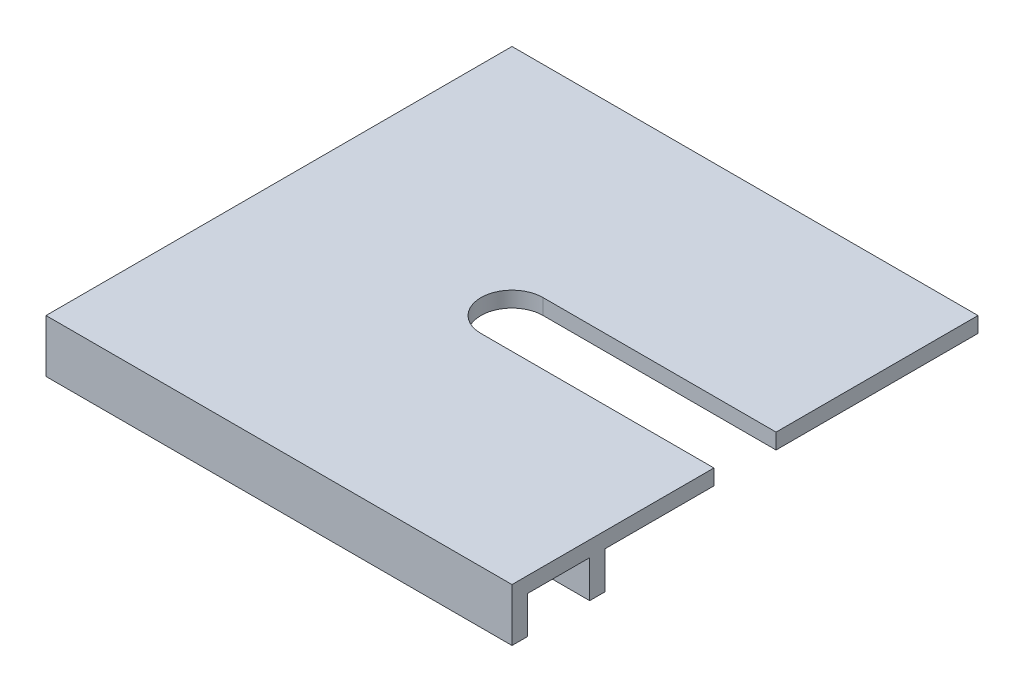
ISO-10303-21;
HEADER;
FILE_DESCRIPTION(('STEP AP214'),'2;1');
FILE_NAME('part.step','',(''),(''),'','','');
FILE_SCHEMA(('AUTOMOTIVE_DESIGN { 1 0 10303 214 1 1 1 1 }'));
ENDSEC;
DATA;
#1=APPLICATION_CONTEXT('core data for automotive mechanical design processes');
#2=APPLICATION_PROTOCOL_DEFINITION('international standard','automotive_design',2000,#1);
#3=PRODUCT_CONTEXT('',#1,'mechanical');
#4=PRODUCT('Part','Part','',(#3));
#5=PRODUCT_RELATED_PRODUCT_CATEGORY('part','',(#4));
#6=PRODUCT_DEFINITION_FORMATION('','',#4);
#7=PRODUCT_DEFINITION_CONTEXT('part definition',#1,'design');
#8=PRODUCT_DEFINITION('design','',#6,#7);
#9=PRODUCT_DEFINITION_SHAPE('','',#8);
#10=(LENGTH_UNIT() NAMED_UNIT(*) SI_UNIT(.MILLI.,.METRE.));
#11=(NAMED_UNIT(*) PLANE_ANGLE_UNIT() SI_UNIT($,.RADIAN.));
#12=(NAMED_UNIT(*) SI_UNIT($,.STERADIAN.) SOLID_ANGLE_UNIT());
#13=UNCERTAINTY_MEASURE_WITH_UNIT(LENGTH_MEASURE(1.E-05),#10,'distance_accuracy_value','');
#14=(GEOMETRIC_REPRESENTATION_CONTEXT(3) GLOBAL_UNCERTAINTY_ASSIGNED_CONTEXT((#13)) GLOBAL_UNIT_ASSIGNED_CONTEXT((#10,
#11,#12)) REPRESENTATION_CONTEXT('',''));
#15=CARTESIAN_POINT('',(0.,0.,0.));
#16=DIRECTION('',(0.,0.,1.));
#17=DIRECTION('',(1.,0.,0.));
#18=AXIS2_PLACEMENT_3D('',#15,#16,#17);
#19=CARTESIAN_POINT('',(0.,0.,0.));
#20=DIRECTION('',(0.,1.,0.));
#21=DIRECTION('',(0.,0.,1.));
#22=AXIS2_PLACEMENT_3D('',#19,#20,#21);
#23=PLANE('',#22);
#24=DIRECTION('',(1.,0.,0.));
#25=VECTOR('',#24,1.);
#26=CARTESIAN_POINT('',(0.,0.,-12.));
#27=LINE('',#26,#25);
#28=CARTESIAN_POINT('',(12.,0.,-12.));
#29=VERTEX_POINT('',#28);
#30=CARTESIAN_POINT('',(60.,0.,-12.));
#31=VERTEX_POINT('',#30);
#32=EDGE_CURVE('E271',#29,#31,#27,.T.);
#33=ORIENTED_EDGE('',*,*,#32,.F.);
#34=DIRECTION('',(0.,0.,1.));
#35=VECTOR('',#34,1.);
#36=CARTESIAN_POINT('',(12.,0.,0.));
#37=LINE('',#36,#35);
#38=CARTESIAN_POINT('',(12.,0.,-60.));
#39=VERTEX_POINT('',#38);
#40=EDGE_CURVE('E268',#39,#29,#37,.T.);
#41=ORIENTED_EDGE('',*,*,#40,.F.);
#42=DIRECTION('',(1.,0.,0.));
#43=VECTOR('',#42,1.);
#44=CARTESIAN_POINT('',(0.,0.,-60.));
#45=LINE('',#44,#43);
#46=CARTESIAN_POINT('',(60.,0.,-60.));
#47=VERTEX_POINT('',#46);
#48=EDGE_CURVE('E317',#39,#47,#45,.T.);
#49=ORIENTED_EDGE('',*,*,#48,.T.);
#50=DIRECTION('',(0.,0.,-1.));
#51=VECTOR('',#50,1.);
#52=CARTESIAN_POINT('',(60.,0.,0.));
#53=LINE('',#52,#51);
#54=CARTESIAN_POINT('',(60.,0.,-34.));
#55=VERTEX_POINT('',#54);
#56=EDGE_CURVE('E314',#55,#47,#53,.T.);
#57=ORIENTED_EDGE('',*,*,#56,.F.);
#58=DIRECTION('',(-1.,0.,0.));
#59=VECTOR('',#58,1.);
#60=CARTESIAN_POINT('',(0.,0.,-34.));
#61=LINE('',#60,#59);
#62=CARTESIAN_POINT('',(30.,0.,-34.));
#63=VERTEX_POINT('',#62);
#64=EDGE_CURVE('E311',#55,#63,#61,.T.);
#65=ORIENTED_EDGE('',*,*,#64,.T.);
#66=CARTESIAN_POINT('',(30.,0.,-30.));
#67=DIRECTION('',(0.,1.,0.));
#68=DIRECTION('',(0.,0.,1.));
#69=AXIS2_PLACEMENT_3D('',#66,#67,#68);
#70=CIRCLE('',#69,4.);
#71=CARTESIAN_POINT('',(30.,0.,-26.));
#72=VERTEX_POINT('',#71);
#73=EDGE_CURVE('E286',#63,#72,#70,.T.);
#74=ORIENTED_EDGE('',*,*,#73,.T.);
#75=DIRECTION('',(1.,0.,0.));
#76=VECTOR('',#75,1.);
#77=CARTESIAN_POINT('',(0.,0.,-26.));
#78=LINE('',#77,#76);
#79=CARTESIAN_POINT('',(60.,0.,-26.));
#80=VERTEX_POINT('',#79);
#81=EDGE_CURVE('E291',#72,#80,#78,.T.);
#82=ORIENTED_EDGE('',*,*,#81,.T.);
#83=EDGE_CURVE('E318',#31,#80,#53,.T.);
#84=ORIENTED_EDGE('',*,*,#83,.F.);
#85=EDGE_LOOP('',(#33,#41,#49,#57,#65,#74,#82,#84));
#86=FACE_BOUND('',#85,.T.);
#87=ADVANCED_FACE('F73',(#86),#23,.F.);
#88=DIRECTION('',(-1.,0.,0.));
#89=VECTOR('',#88,1.);
#90=CARTESIAN_POINT('',(0.,0.,-2.));
#91=LINE('',#90,#89);
#92=CARTESIAN_POINT('',(60.,0.,-2.));
#93=VERTEX_POINT('',#92);
#94=CARTESIAN_POINT('',(2.,0.,-2.));
#95=VERTEX_POINT('',#94);
#96=EDGE_CURVE('E236',#93,#95,#91,.T.);
#97=ORIENTED_EDGE('',*,*,#96,.T.);
#98=DIRECTION('',(0.,0.,-1.));
#99=VECTOR('',#98,1.);
#100=CARTESIAN_POINT('',(2.,0.,0.));
#101=LINE('',#100,#99);
#102=CARTESIAN_POINT('',(2.,0.,-60.));
#103=VERTEX_POINT('',#102);
#104=EDGE_CURVE('E246',#95,#103,#101,.T.);
#105=ORIENTED_EDGE('',*,*,#104,.T.);
#106=CARTESIAN_POINT('',(9.99999999999999,0.,-60.));
#107=VERTEX_POINT('',#106);
#108=EDGE_CURVE('E319',#103,#107,#45,.T.);
#109=ORIENTED_EDGE('',*,*,#108,.T.);
#110=DIRECTION('',(0.,0.,-1.));
#111=VECTOR('',#110,1.);
#112=CARTESIAN_POINT('',(10.,0.,0.));
#113=LINE('',#112,#111);
#114=CARTESIAN_POINT('',(10.,0.,-10.));
#115=VERTEX_POINT('',#114);
#116=EDGE_CURVE('E265',#115,#107,#113,.T.);
#117=ORIENTED_EDGE('',*,*,#116,.F.);
#118=DIRECTION('',(-1.,0.,0.));
#119=VECTOR('',#118,1.);
#120=CARTESIAN_POINT('',(0.,0.,-10.));
#121=LINE('',#120,#119);
#122=CARTESIAN_POINT('',(60.,0.,-10.));
#123=VERTEX_POINT('',#122);
#124=EDGE_CURVE('E242',#123,#115,#121,.T.);
#125=ORIENTED_EDGE('',*,*,#124,.F.);
#126=EDGE_CURVE('E258',#93,#123,#53,.T.);
#127=ORIENTED_EDGE('',*,*,#126,.F.);
#128=EDGE_LOOP('',(#97,#105,#109,#117,#125,#127));
#129=FACE_BOUND('',#128,.T.);
#130=ADVANCED_FACE('F255',(#129),#23,.F.);
#131=CARTESIAN_POINT('',(30.,2.,-30.));
#132=DIRECTION('',(0.,-1.,0.));
#133=DIRECTION('',(0.,0.,-1.));
#134=AXIS2_PLACEMENT_3D('',#131,#132,#133);
#135=CYLINDRICAL_SURFACE('',#134,4.);
#136=ORIENTED_EDGE('',*,*,#73,.F.);
#137=DIRECTION('',(0.,-1.,0.));
#138=VECTOR('',#137,1.);
#139=CARTESIAN_POINT('',(30.,2.,-34.));
#140=LINE('',#139,#138);
#141=CARTESIAN_POINT('',(30.,2.,-34.));
#142=VERTEX_POINT('',#141);
#143=EDGE_CURVE('E341',#142,#63,#140,.T.);
#144=ORIENTED_EDGE('',*,*,#143,.F.);
#145=CARTESIAN_POINT('',(30.,2.,-30.));
#146=DIRECTION('',(0.,1.,0.));
#147=DIRECTION('',(0.,0.,1.));
#148=AXIS2_PLACEMENT_3D('',#145,#146,#147);
#149=CIRCLE('',#148,4.);
#150=CARTESIAN_POINT('',(30.,2.,-26.));
#151=VERTEX_POINT('',#150);
#152=EDGE_CURVE('E287',#142,#151,#149,.T.);
#153=ORIENTED_EDGE('',*,*,#152,.T.);
#154=DIRECTION('',(0.,-1.,0.));
#155=VECTOR('',#154,1.);
#156=CARTESIAN_POINT('',(30.,2.,-26.));
#157=LINE('',#156,#155);
#158=EDGE_CURVE('E308',#151,#72,#157,.T.);
#159=ORIENTED_EDGE('',*,*,#158,.T.);
#160=EDGE_LOOP('',(#136,#144,#153,#159));
#161=FACE_BOUND('',#160,.T.);
#162=ADVANCED_FACE('F456',(#161),#135,.F.);
#163=CARTESIAN_POINT('',(0.,2.,-34.));
#164=DIRECTION('',(0.,0.,1.));
#165=DIRECTION('',(1.,0.,0.));
#166=AXIS2_PLACEMENT_3D('',#163,#164,#165);
#167=PLANE('',#166);
#168=ORIENTED_EDGE('',*,*,#64,.F.);
#169=DIRECTION('',(0.,-1.,0.));
#170=VECTOR('',#169,1.);
#171=CARTESIAN_POINT('',(60.,2.,-34.));
#172=LINE('',#171,#170);
#173=CARTESIAN_POINT('',(60.,2.,-34.));
#174=VERTEX_POINT('',#173);
#175=EDGE_CURVE('E339',#174,#55,#172,.T.);
#176=ORIENTED_EDGE('',*,*,#175,.F.);
#177=DIRECTION('',(-1.,0.,0.));
#178=VECTOR('',#177,1.);
#179=CARTESIAN_POINT('',(0.,2.,-34.));
#180=LINE('',#179,#178);
#181=EDGE_CURVE('E290',#174,#142,#180,.T.);
#182=ORIENTED_EDGE('',*,*,#181,.T.);
#183=ORIENTED_EDGE('',*,*,#143,.T.);
#184=EDGE_LOOP('',(#168,#176,#182,#183));
#185=FACE_BOUND('',#184,.T.);
#186=ADVANCED_FACE('F505',(#185),#167,.T.);
#187=CARTESIAN_POINT('',(60.,2.,0.));
#188=DIRECTION('',(-1.,0.,0.));
#189=DIRECTION('',(0.,0.,1.));
#190=AXIS2_PLACEMENT_3D('',#187,#188,#189);
#191=PLANE('',#190);
#192=ORIENTED_EDGE('',*,*,#56,.T.);
#193=DIRECTION('',(0.,-1.,0.));
#194=VECTOR('',#193,1.);
#195=CARTESIAN_POINT('',(60.,2.,-60.));
#196=LINE('',#195,#194);
#197=CARTESIAN_POINT('',(60.,2.,-60.));
#198=VERTEX_POINT('',#197);
#199=EDGE_CURVE('E336',#198,#47,#196,.T.);
#200=ORIENTED_EDGE('',*,*,#199,.F.);
#201=DIRECTION('',(0.,0.,-1.));
#202=VECTOR('',#201,1.);
#203=CARTESIAN_POINT('',(60.,2.,0.));
#204=LINE('',#203,#202);
#205=EDGE_CURVE('E294',#174,#198,#204,.T.);
#206=ORIENTED_EDGE('',*,*,#205,.F.);
#207=ORIENTED_EDGE('',*,*,#175,.T.);
#208=EDGE_LOOP('',(#192,#200,#206,#207));
#209=FACE_BOUND('',#208,.T.);
#210=ADVANCED_FACE('F502',(#209),#191,.F.);
#211=CARTESIAN_POINT('',(0.,2.,-60.));
#212=DIRECTION('',(0.,0.,-1.));
#213=DIRECTION('',(-1.,0.,0.));
#214=AXIS2_PLACEMENT_3D('',#211,#212,#213);
#215=PLANE('',#214);
#216=DIRECTION('',(0.,1.,0.));
#217=VECTOR('',#216,1.);
#218=CARTESIAN_POINT('',(2.,-5.,-60.));
#219=LINE('',#218,#217);
#220=CARTESIAN_POINT('',(2.,-4.80000000000001,-60.));
#221=VERTEX_POINT('',#220);
#222=EDGE_CURVE('E249',#221,#103,#219,.T.);
#223=ORIENTED_EDGE('',*,*,#222,.F.);
#224=DIRECTION('',(-1.,0.,0.));
#225=VECTOR('',#224,1.);
#226=CARTESIAN_POINT('',(0.,-4.80000000000001,-60.));
#227=LINE('',#226,#225);
#228=CARTESIAN_POINT('',(0.,-4.80000000000001,-60.));
#229=VERTEX_POINT('',#228);
#230=EDGE_CURVE('E358',#221,#229,#227,.T.);
#231=ORIENTED_EDGE('',*,*,#230,.T.);
#232=DIRECTION('',(0.,-1.,0.));
#233=VECTOR('',#232,1.);
#234=CARTESIAN_POINT('',(0.,2.,-60.));
#235=LINE('',#234,#233);
#236=CARTESIAN_POINT('',(0.,2.,-60.));
#237=VERTEX_POINT('',#236);
#238=EDGE_CURVE('E333',#237,#229,#235,.T.);
#239=ORIENTED_EDGE('',*,*,#238,.F.);
#240=DIRECTION('',(1.,0.,0.));
#241=VECTOR('',#240,1.);
#242=CARTESIAN_POINT('',(0.,2.,-60.));
#243=LINE('',#242,#241);
#244=EDGE_CURVE('E296',#237,#198,#243,.T.);
#245=ORIENTED_EDGE('',*,*,#244,.T.);
#246=ORIENTED_EDGE('',*,*,#199,.T.);
#247=ORIENTED_EDGE('',*,*,#48,.F.);
#248=DIRECTION('',(0.,1.,0.));
#249=VECTOR('',#248,1.);
#250=CARTESIAN_POINT('',(12.,-5.,-60.));
#251=LINE('',#250,#249);
#252=CARTESIAN_POINT('',(12.,-4.79999999999999,-60.));
#253=VERTEX_POINT('',#252);
#254=EDGE_CURVE('E280',#253,#39,#251,.T.);
#255=ORIENTED_EDGE('',*,*,#254,.F.);
#256=DIRECTION('',(-1.,0.,0.));
#257=VECTOR('',#256,1.);
#258=CARTESIAN_POINT('',(0.,-4.79999999999999,-60.));
#259=LINE('',#258,#257);
#260=CARTESIAN_POINT('',(9.99999999999999,-4.79999999999999,-60.));
#261=VERTEX_POINT('',#260);
#262=EDGE_CURVE('E356',#253,#261,#259,.T.);
#263=ORIENTED_EDGE('',*,*,#262,.T.);
#264=DIRECTION('',(0.,1.,0.));
#265=VECTOR('',#264,1.);
#266=CARTESIAN_POINT('',(9.99999999999999,-5.,-60.));
#267=LINE('',#266,#265);
#268=EDGE_CURVE('E282',#261,#107,#267,.T.);
#269=ORIENTED_EDGE('',*,*,#268,.T.);
#270=ORIENTED_EDGE('',*,*,#108,.F.);
#271=EDGE_LOOP('',(#223,#231,#239,#245,#246,#247,#255,#263,#269,#270));
#272=FACE_BOUND('',#271,.T.);
#273=ADVANCED_FACE('F431',(#272),#215,.T.);
#274=CARTESIAN_POINT('',(0.,2.,0.));
#275=DIRECTION('',(-1.,0.,0.));
#276=DIRECTION('',(0.,0.,1.));
#277=AXIS2_PLACEMENT_3D('',#274,#275,#276);
#278=PLANE('',#277);
#279=ORIENTED_EDGE('',*,*,#238,.T.);
#280=DIRECTION('',(0.,0.,1.));
#281=VECTOR('',#280,1.);
#282=CARTESIAN_POINT('',(0.,-4.80000000000001,0.));
#283=LINE('',#282,#281);
#284=CARTESIAN_POINT('',(0.,-4.80000000000001,0.));
#285=VERTEX_POINT('',#284);
#286=EDGE_CURVE('E361',#229,#285,#283,.T.);
#287=ORIENTED_EDGE('',*,*,#286,.T.);
#288=DIRECTION('',(0.,-1.,0.));
#289=VECTOR('',#288,1.);
#290=CARTESIAN_POINT('',(0.,2.,0.));
#291=LINE('',#290,#289);
#292=CARTESIAN_POINT('',(0.,2.,0.));
#293=VERTEX_POINT('',#292);
#294=EDGE_CURVE('E330',#293,#285,#291,.T.);
#295=ORIENTED_EDGE('',*,*,#294,.F.);
#296=DIRECTION('',(0.,0.,-1.));
#297=VECTOR('',#296,1.);
#298=CARTESIAN_POINT('',(0.,2.,0.));
#299=LINE('',#298,#297);
#300=EDGE_CURVE('E300',#293,#237,#299,.T.);
#301=ORIENTED_EDGE('',*,*,#300,.T.);
#302=EDGE_LOOP('',(#279,#287,#295,#301));
#303=FACE_BOUND('',#302,.T.);
#304=ADVANCED_FACE('F496',(#303),#278,.T.);
#305=CARTESIAN_POINT('',(0.,2.,0.));
#306=DIRECTION('',(0.,0.,-1.));
#307=DIRECTION('',(-1.,0.,0.));
#308=AXIS2_PLACEMENT_3D('',#305,#306,#307);
#309=PLANE('',#308);
#310=ORIENTED_EDGE('',*,*,#294,.T.);
#311=DIRECTION('',(1.,0.,0.));
#312=VECTOR('',#311,1.);
#313=CARTESIAN_POINT('',(60.,-4.80000000000001,0.));
#314=LINE('',#313,#312);
#315=CARTESIAN_POINT('',(60.,-4.80000000000001,0.));
#316=VERTEX_POINT('',#315);
#317=EDGE_CURVE('E363',#285,#316,#314,.T.);
#318=ORIENTED_EDGE('',*,*,#317,.T.);
#319=DIRECTION('',(0.,-1.,0.));
#320=VECTOR('',#319,1.);
#321=CARTESIAN_POINT('',(60.,2.,0.));
#322=LINE('',#321,#320);
#323=CARTESIAN_POINT('',(60.,2.,0.));
#324=VERTEX_POINT('',#323);
#325=EDGE_CURVE('E327',#324,#316,#322,.T.);
#326=ORIENTED_EDGE('',*,*,#325,.F.);
#327=DIRECTION('',(1.,0.,0.));
#328=VECTOR('',#327,1.);
#329=CARTESIAN_POINT('',(0.,2.,0.));
#330=LINE('',#329,#328);
#331=EDGE_CURVE('E303',#293,#324,#330,.T.);
#332=ORIENTED_EDGE('',*,*,#331,.F.);
#333=EDGE_LOOP('',(#310,#318,#326,#332));
#334=FACE_BOUND('',#333,.T.);
#335=ADVANCED_FACE('F497',(#334),#309,.F.);
#336=ORIENTED_EDGE('',*,*,#325,.T.);
#337=DIRECTION('',(0.,0.,-1.));
#338=VECTOR('',#337,1.);
#339=CARTESIAN_POINT('',(60.,-4.80000000000001,-2.));
#340=LINE('',#339,#338);
#341=CARTESIAN_POINT('',(60.,-4.80000000000001,-2.));
#342=VERTEX_POINT('',#341);
#343=EDGE_CURVE('E368',#316,#342,#340,.T.);
#344=ORIENTED_EDGE('',*,*,#343,.T.);
#345=DIRECTION('',(0.,1.,0.));
#346=VECTOR('',#345,1.);
#347=CARTESIAN_POINT('',(60.,-5.,-2.));
#348=LINE('',#347,#346);
#349=EDGE_CURVE('E243',#342,#93,#348,.T.);
#350=ORIENTED_EDGE('',*,*,#349,.T.);
#351=ORIENTED_EDGE('',*,*,#126,.T.);
#352=DIRECTION('',(0.,1.,0.));
#353=VECTOR('',#352,1.);
#354=CARTESIAN_POINT('',(60.,-5.,-10.));
#355=LINE('',#354,#353);
#356=CARTESIAN_POINT('',(60.,-4.79999999999999,-10.));
#357=VERTEX_POINT('',#356);
#358=EDGE_CURVE('E274',#357,#123,#355,.T.);
#359=ORIENTED_EDGE('',*,*,#358,.F.);
#360=DIRECTION('',(0.,0.,-1.));
#361=VECTOR('',#360,1.);
#362=CARTESIAN_POINT('',(60.,-4.79999999999999,-12.));
#363=LINE('',#362,#361);
#364=CARTESIAN_POINT('',(60.,-4.79999999999999,-12.));
#365=VERTEX_POINT('',#364);
#366=EDGE_CURVE('E365',#357,#365,#363,.T.);
#367=ORIENTED_EDGE('',*,*,#366,.T.);
#368=DIRECTION('',(0.,1.,0.));
#369=VECTOR('',#368,1.);
#370=CARTESIAN_POINT('',(60.,-5.,-12.));
#371=LINE('',#370,#369);
#372=EDGE_CURVE('E276',#365,#31,#371,.T.);
#373=ORIENTED_EDGE('',*,*,#372,.T.);
#374=ORIENTED_EDGE('',*,*,#83,.T.);
#375=DIRECTION('',(0.,-1.,0.));
#376=VECTOR('',#375,1.);
#377=CARTESIAN_POINT('',(60.,2.,-26.));
#378=LINE('',#377,#376);
#379=CARTESIAN_POINT('',(60.,2.,-26.));
#380=VERTEX_POINT('',#379);
#381=EDGE_CURVE('E324',#380,#80,#378,.T.);
#382=ORIENTED_EDGE('',*,*,#381,.F.);
#383=EDGE_CURVE('E297',#324,#380,#204,.T.);
#384=ORIENTED_EDGE('',*,*,#383,.F.);
#385=EDGE_LOOP('',(#336,#344,#350,#351,#359,#367,#373,#374,#382,#384));
#386=FACE_BOUND('',#385,.T.);
#387=ADVANCED_FACE('F442',(#386),#191,.F.);
#388=CARTESIAN_POINT('',(0.,2.,-26.));
#389=DIRECTION('',(0.,0.,-1.));
#390=DIRECTION('',(-1.,0.,0.));
#391=AXIS2_PLACEMENT_3D('',#388,#389,#390);
#392=PLANE('',#391);
#393=ORIENTED_EDGE('',*,*,#81,.F.);
#394=ORIENTED_EDGE('',*,*,#158,.F.);
#395=DIRECTION('',(1.,0.,0.));
#396=VECTOR('',#395,1.);
#397=CARTESIAN_POINT('',(0.,2.,-26.));
#398=LINE('',#397,#396);
#399=EDGE_CURVE('E305',#151,#380,#398,.T.);
#400=ORIENTED_EDGE('',*,*,#399,.T.);
#401=ORIENTED_EDGE('',*,*,#381,.T.);
#402=EDGE_LOOP('',(#393,#394,#400,#401));
#403=FACE_BOUND('',#402,.T.);
#404=ADVANCED_FACE('F450',(#403),#392,.T.);
#405=CARTESIAN_POINT('',(0.,2.,0.));
#406=DIRECTION('',(0.,1.,0.));
#407=DIRECTION('',(0.,0.,1.));
#408=AXIS2_PLACEMENT_3D('',#405,#406,#407);
#409=PLANE('',#408);
#410=ORIENTED_EDGE('',*,*,#152,.F.);
#411=ORIENTED_EDGE('',*,*,#181,.F.);
#412=ORIENTED_EDGE('',*,*,#205,.T.);
#413=ORIENTED_EDGE('',*,*,#244,.F.);
#414=ORIENTED_EDGE('',*,*,#300,.F.);
#415=ORIENTED_EDGE('',*,*,#331,.T.);
#416=ORIENTED_EDGE('',*,*,#383,.T.);
#417=ORIENTED_EDGE('',*,*,#399,.F.);
#418=EDGE_LOOP('',(#410,#411,#412,#413,#414,#415,#416,#417));
#419=FACE_BOUND('',#418,.T.);
#420=ADVANCED_FACE('F460',(#419),#409,.T.);
#421=CARTESIAN_POINT('',(0.,-5.,-10.));
#422=DIRECTION('',(0.,0.,-1.));
#423=DIRECTION('',(-1.,0.,0.));
#424=AXIS2_PLACEMENT_3D('',#421,#422,#423);
#425=PLANE('',#424);
#426=DIRECTION('',(0.,1.,0.));
#427=VECTOR('',#426,1.);
#428=CARTESIAN_POINT('',(10.,-5.,-10.));
#429=LINE('',#428,#427);
#430=CARTESIAN_POINT('',(10.,-4.79999999999999,-10.));
#431=VERTEX_POINT('',#430);
#432=EDGE_CURVE('E284',#431,#115,#429,.T.);
#433=ORIENTED_EDGE('',*,*,#432,.F.);
#434=DIRECTION('',(1.,0.,0.));
#435=VECTOR('',#434,1.);
#436=CARTESIAN_POINT('',(60.,-4.79999999999999,-10.));
#437=LINE('',#436,#435);
#438=EDGE_CURVE('E12',#431,#357,#437,.T.);
#439=ORIENTED_EDGE('',*,*,#438,.T.);
#440=ORIENTED_EDGE('',*,*,#358,.T.);
#441=ORIENTED_EDGE('',*,*,#124,.T.);
#442=EDGE_LOOP('',(#433,#439,#440,#441));
#443=FACE_BOUND('',#442,.T.);
#444=ADVANCED_FACE('F436',(#443),#425,.F.);
#445=CARTESIAN_POINT('',(10.,-5.,0.));
#446=DIRECTION('',(1.,0.,0.));
#447=DIRECTION('',(0.,0.,-1.));
#448=AXIS2_PLACEMENT_3D('',#445,#446,#447);
#449=PLANE('',#448);
#450=ORIENTED_EDGE('',*,*,#268,.F.);
#451=DIRECTION('',(0.,0.,1.));
#452=VECTOR('',#451,1.);
#453=CARTESIAN_POINT('',(10.,-4.79999999999999,-10.));
#454=LINE('',#453,#452);
#455=EDGE_CURVE('E83',#261,#431,#454,.T.);
#456=ORIENTED_EDGE('',*,*,#455,.T.);
#457=ORIENTED_EDGE('',*,*,#432,.T.);
#458=ORIENTED_EDGE('',*,*,#116,.T.);
#459=EDGE_LOOP('',(#450,#456,#457,#458));
#460=FACE_BOUND('',#459,.T.);
#461=ADVANCED_FACE('F433',(#460),#449,.F.);
#462=CARTESIAN_POINT('',(12.,-5.,0.));
#463=DIRECTION('',(-1.,0.,0.));
#464=DIRECTION('',(0.,0.,1.));
#465=AXIS2_PLACEMENT_3D('',#462,#463,#464);
#466=PLANE('',#465);
#467=DIRECTION('',(0.,1.,0.));
#468=VECTOR('',#467,1.);
#469=CARTESIAN_POINT('',(12.,-5.,-12.));
#470=LINE('',#469,#468);
#471=CARTESIAN_POINT('',(12.,-4.79999999999999,-12.));
#472=VERTEX_POINT('',#471);
#473=EDGE_CURVE('E278',#472,#29,#470,.T.);
#474=ORIENTED_EDGE('',*,*,#473,.F.);
#475=DIRECTION('',(0.,0.,-1.));
#476=VECTOR('',#475,1.);
#477=CARTESIAN_POINT('',(12.,-4.79999999999999,-60.));
#478=LINE('',#477,#476);
#479=EDGE_CURVE('E387',#472,#253,#478,.T.);
#480=ORIENTED_EDGE('',*,*,#479,.T.);
#481=ORIENTED_EDGE('',*,*,#254,.T.);
#482=ORIENTED_EDGE('',*,*,#40,.T.);
#483=EDGE_LOOP('',(#474,#480,#481,#482));
#484=FACE_BOUND('',#483,.T.);
#485=ADVANCED_FACE('F567',(#484),#466,.F.);
#486=CARTESIAN_POINT('',(0.,-5.,-12.));
#487=DIRECTION('',(0.,0.,1.));
#488=DIRECTION('',(1.,0.,0.));
#489=AXIS2_PLACEMENT_3D('',#486,#487,#488);
#490=PLANE('',#489);
#491=ORIENTED_EDGE('',*,*,#372,.F.);
#492=DIRECTION('',(-1.,0.,0.));
#493=VECTOR('',#492,1.);
#494=CARTESIAN_POINT('',(12.,-4.79999999999999,-12.));
#495=LINE('',#494,#493);
#496=EDGE_CURVE('E98',#365,#472,#495,.T.);
#497=ORIENTED_EDGE('',*,*,#496,.T.);
#498=ORIENTED_EDGE('',*,*,#473,.T.);
#499=ORIENTED_EDGE('',*,*,#32,.T.);
#500=EDGE_LOOP('',(#491,#497,#498,#499));
#501=FACE_BOUND('',#500,.T.);
#502=ADVANCED_FACE('F574',(#501),#490,.F.);
#503=CARTESIAN_POINT('',(0.,-5.,0.));
#504=DIRECTION('',(0.,-1.,0.));
#505=DIRECTION('',(0.,0.,-1.));
#506=AXIS2_PLACEMENT_3D('',#503,#504,#505);
#507=PLANE('',#506);
#508=DIRECTION('',(1.,0.,0.));
#509=VECTOR('',#508,1.);
#510=CARTESIAN_POINT('',(60.,-5.,-11.8));
#511=LINE('',#510,#509);
#512=CARTESIAN_POINT('',(11.8,-5.,-11.8));
#513=VERTEX_POINT('',#512);
#514=CARTESIAN_POINT('',(59.8,-5.,-11.8));
#515=VERTEX_POINT('',#514);
#516=EDGE_CURVE('E381',#513,#515,#511,.T.);
#517=ORIENTED_EDGE('',*,*,#516,.T.);
#518=DIRECTION('',(0.,0.,1.));
#519=VECTOR('',#518,1.);
#520=CARTESIAN_POINT('',(59.8,-5.,-10.));
#521=LINE('',#520,#519);
#522=CARTESIAN_POINT('',(59.8,-5.,-10.2));
#523=VERTEX_POINT('',#522);
#524=EDGE_CURVE('E383',#515,#523,#521,.T.);
#525=ORIENTED_EDGE('',*,*,#524,.T.);
#526=DIRECTION('',(-1.,0.,0.));
#527=VECTOR('',#526,1.);
#528=CARTESIAN_POINT('',(10.,-5.,-10.2));
#529=LINE('',#528,#527);
#530=CARTESIAN_POINT('',(10.2,-5.,-10.2));
#531=VERTEX_POINT('',#530);
#532=EDGE_CURVE('E373',#523,#531,#529,.T.);
#533=ORIENTED_EDGE('',*,*,#532,.T.);
#534=DIRECTION('',(0.,0.,-1.));
#535=VECTOR('',#534,1.);
#536=CARTESIAN_POINT('',(10.2,-5.,-60.));
#537=LINE('',#536,#535);
#538=CARTESIAN_POINT('',(10.2,-5.,-59.8));
#539=VERTEX_POINT('',#538);
#540=EDGE_CURVE('E375',#531,#539,#537,.T.);
#541=ORIENTED_EDGE('',*,*,#540,.T.);
#542=DIRECTION('',(1.,0.,0.));
#543=VECTOR('',#542,1.);
#544=CARTESIAN_POINT('',(0.,-5.,-59.8));
#545=LINE('',#544,#543);
#546=CARTESIAN_POINT('',(11.8,-5.,-59.8));
#547=VERTEX_POINT('',#546);
#548=EDGE_CURVE('E377',#539,#547,#545,.T.);
#549=ORIENTED_EDGE('',*,*,#548,.T.);
#550=DIRECTION('',(0.,0.,1.));
#551=VECTOR('',#550,1.);
#552=CARTESIAN_POINT('',(11.8,-5.,-12.));
#553=LINE('',#552,#551);
#554=EDGE_CURVE('E379',#547,#513,#553,.T.);
#555=ORIENTED_EDGE('',*,*,#554,.T.);
#556=EDGE_LOOP('',(#517,#525,#533,#541,#549,#555));
#557=FACE_BOUND('',#556,.T.);
#558=ADVANCED_FACE('F582',(#557),#507,.T.);
#559=CARTESIAN_POINT('',(2.,-5.,0.));
#560=DIRECTION('',(1.,0.,0.));
#561=DIRECTION('',(0.,0.,-1.));
#562=AXIS2_PLACEMENT_3D('',#559,#560,#561);
#563=PLANE('',#562);
#564=DIRECTION('',(0.,1.,0.));
#565=VECTOR('',#564,1.);
#566=CARTESIAN_POINT('',(2.,-5.,-2.));
#567=LINE('',#566,#565);
#568=CARTESIAN_POINT('',(2.,-4.80000000000001,-2.));
#569=VERTEX_POINT('',#568);
#570=EDGE_CURVE('E231',#569,#95,#567,.T.);
#571=ORIENTED_EDGE('',*,*,#570,.F.);
#572=DIRECTION('',(0.,0.,-1.));
#573=VECTOR('',#572,1.);
#574=CARTESIAN_POINT('',(2.,-4.80000000000001,0.));
#575=LINE('',#574,#573);
#576=EDGE_CURVE('E371',#569,#221,#575,.T.);
#577=ORIENTED_EDGE('',*,*,#576,.T.);
#578=ORIENTED_EDGE('',*,*,#222,.T.);
#579=ORIENTED_EDGE('',*,*,#104,.F.);
#580=EDGE_LOOP('',(#571,#577,#578,#579));
#581=FACE_BOUND('',#580,.T.);
#582=ADVANCED_FACE('F247',(#581),#563,.T.);
#583=CARTESIAN_POINT('',(0.,-5.,-2.));
#584=DIRECTION('',(0.,0.,-1.));
#585=DIRECTION('',(-1.,0.,0.));
#586=AXIS2_PLACEMENT_3D('',#583,#584,#585);
#587=PLANE('',#586);
#588=ORIENTED_EDGE('',*,*,#349,.F.);
#589=DIRECTION('',(-1.,0.,0.));
#590=VECTOR('',#589,1.);
#591=CARTESIAN_POINT('',(0.,-4.80000000000001,-2.));
#592=LINE('',#591,#590);
#593=EDGE_CURVE('E239',#342,#569,#592,.T.);
#594=ORIENTED_EDGE('',*,*,#593,.T.);
#595=ORIENTED_EDGE('',*,*,#570,.T.);
#596=ORIENTED_EDGE('',*,*,#96,.F.);
#597=EDGE_LOOP('',(#588,#594,#595,#596));
#598=FACE_BOUND('',#597,.T.);
#599=ADVANCED_FACE('F234',(#598),#587,.T.);
#600=CARTESIAN_POINT('',(0.,-5.,0.));
#601=DIRECTION('',(0.,-1.,0.));
#602=DIRECTION('',(0.,0.,-1.));
#603=AXIS2_PLACEMENT_3D('',#600,#601,#602);
#604=PLANE('',#603);
#605=DIRECTION('',(0.,0.,-1.));
#606=VECTOR('',#605,1.);
#607=CARTESIAN_POINT('',(0.199999999999985,-5.,0.));
#608=LINE('',#607,#606);
#609=CARTESIAN_POINT('',(0.199999999999985,-5.,-0.199999999999985));
#610=VERTEX_POINT('',#609);
#611=CARTESIAN_POINT('',(0.199999999999985,-5.,-59.8));
#612=VERTEX_POINT('',#611);
#613=EDGE_CURVE('E351',#610,#612,#608,.T.);
#614=ORIENTED_EDGE('',*,*,#613,.T.);
#615=DIRECTION('',(1.,0.,0.));
#616=VECTOR('',#615,1.);
#617=CARTESIAN_POINT('',(0.,-5.,-59.8));
#618=LINE('',#617,#616);
#619=CARTESIAN_POINT('',(1.80000000000002,-5.,-59.8));
#620=VERTEX_POINT('',#619);
#621=EDGE_CURVE('E353',#612,#620,#618,.T.);
#622=ORIENTED_EDGE('',*,*,#621,.T.);
#623=DIRECTION('',(0.,0.,1.));
#624=VECTOR('',#623,1.);
#625=CARTESIAN_POINT('',(1.80000000000001,-5.,0.));
#626=LINE('',#625,#624);
#627=CARTESIAN_POINT('',(1.80000000000001,-5.,-1.80000000000002));
#628=VERTEX_POINT('',#627);
#629=EDGE_CURVE('E343',#620,#628,#626,.T.);
#630=ORIENTED_EDGE('',*,*,#629,.T.);
#631=DIRECTION('',(1.,0.,0.));
#632=VECTOR('',#631,1.);
#633=CARTESIAN_POINT('',(0.,-5.,-1.80000000000002));
#634=LINE('',#633,#632);
#635=CARTESIAN_POINT('',(59.8,-5.,-1.80000000000001));
#636=VERTEX_POINT('',#635);
#637=EDGE_CURVE('E345',#628,#636,#634,.T.);
#638=ORIENTED_EDGE('',*,*,#637,.T.);
#639=DIRECTION('',(0.,0.,1.));
#640=VECTOR('',#639,1.);
#641=CARTESIAN_POINT('',(59.8,-5.,0.));
#642=LINE('',#641,#640);
#643=CARTESIAN_POINT('',(59.8,-5.,-0.199999999999985));
#644=VERTEX_POINT('',#643);
#645=EDGE_CURVE('E347',#636,#644,#642,.T.);
#646=ORIENTED_EDGE('',*,*,#645,.T.);
#647=DIRECTION('',(-1.,0.,0.));
#648=VECTOR('',#647,1.);
#649=CARTESIAN_POINT('',(0.,-5.,-0.199999999999985));
#650=LINE('',#649,#648);
#651=EDGE_CURVE('E349',#644,#610,#650,.T.);
#652=ORIENTED_EDGE('',*,*,#651,.T.);
#653=EDGE_LOOP('',(#614,#622,#630,#638,#646,#652));
#654=FACE_BOUND('',#653,.T.);
#655=ADVANCED_FACE('F478',(#654),#604,.T.);
#656=CARTESIAN_POINT('',(59.8,-5.,0.));
#657=DIRECTION('',(0.707106781186548,-0.707106781186548,0.));
#658=DIRECTION('',(0.,0.,-1.));
#659=AXIS2_PLACEMENT_3D('',#656,#657,#658);
#660=PLANE('',#659);
#661=DIRECTION('',(0.577350269189626,0.577350269189626,-0.577350269189626));
#662=VECTOR('',#661,1.);
#663=CARTESIAN_POINT('',(40.,-24.8,18.));
#664=LINE('',#663,#662);
#665=EDGE_CURVE('E400',#342,#636,#664,.F.);
#666=ORIENTED_EDGE('',*,*,#665,.F.);
#667=ORIENTED_EDGE('',*,*,#343,.F.);
#668=DIRECTION('',(-0.577350269189626,-0.577350269189626,-0.577350269189626));
#669=VECTOR('',#668,1.);
#670=CARTESIAN_POINT('',(59.8666666666667,-4.93333333333334,-0.133333333333323));
#671=LINE('',#670,#669);
#672=EDGE_CURVE('E253',#644,#316,#671,.F.);
#673=ORIENTED_EDGE('',*,*,#672,.F.);
#674=ORIENTED_EDGE('',*,*,#645,.F.);
#675=EDGE_LOOP('',(#666,#667,#673,#674));
#676=FACE_BOUND('',#675,.T.);
#677=ADVANCED_FACE('F469',(#676),#660,.T.);
#678=CARTESIAN_POINT('',(0.,-5.,-0.199999999999985));
#679=DIRECTION('',(0.,-0.707106781186548,0.707106781186548));
#680=DIRECTION('',(1.,0.,0.));
#681=AXIS2_PLACEMENT_3D('',#678,#679,#680);
#682=PLANE('',#681);
#683=ORIENTED_EDGE('',*,*,#672,.T.);
#684=ORIENTED_EDGE('',*,*,#317,.F.);
#685=DIRECTION('',(-0.577350269189626,0.577350269189626,0.577350269189626));
#686=VECTOR('',#685,1.);
#687=CARTESIAN_POINT('',(0.133333333333323,-4.93333333333334,-0.133333333333323));
#688=LINE('',#687,#686);
#689=EDGE_CURVE('E397',#610,#285,#688,.T.);
#690=ORIENTED_EDGE('',*,*,#689,.F.);
#691=ORIENTED_EDGE('',*,*,#651,.F.);
#692=EDGE_LOOP('',(#683,#684,#690,#691));
#693=FACE_BOUND('',#692,.T.);
#694=ADVANCED_FACE('F474',(#693),#682,.T.);
#695=CARTESIAN_POINT('',(0.,-4.80000000000001,-2.));
#696=DIRECTION('',(0.,0.707106781186548,0.707106781186548));
#697=DIRECTION('',(-1.,0.,0.));
#698=AXIS2_PLACEMENT_3D('',#695,#696,#697);
#699=PLANE('',#698);
#700=ORIENTED_EDGE('',*,*,#665,.T.);
#701=ORIENTED_EDGE('',*,*,#637,.F.);
#702=DIRECTION('',(-0.577350269189626,-0.577350269189626,0.577350269189626));
#703=VECTOR('',#702,1.);
#704=CARTESIAN_POINT('',(1.33333333333333,-5.46666666666668,-1.33333333333334));
#705=LINE('',#704,#703);
#706=EDGE_CURVE('E394',#569,#628,#705,.T.);
#707=ORIENTED_EDGE('',*,*,#706,.F.);
#708=ORIENTED_EDGE('',*,*,#593,.F.);
#709=EDGE_LOOP('',(#700,#701,#707,#708));
#710=FACE_BOUND('',#709,.T.);
#711=ADVANCED_FACE('F482',(#710),#699,.F.);
#712=CARTESIAN_POINT('',(0.199999999999985,-5.,0.));
#713=DIRECTION('',(0.707106781186548,0.707106781186548,0.));
#714=DIRECTION('',(0.,0.,-1.));
#715=AXIS2_PLACEMENT_3D('',#712,#713,#714);
#716=PLANE('',#715);
#717=ORIENTED_EDGE('',*,*,#689,.T.);
#718=ORIENTED_EDGE('',*,*,#286,.F.);
#719=DIRECTION('',(0.577350269189626,-0.577350269189626,0.577350269189626));
#720=VECTOR('',#719,1.);
#721=CARTESIAN_POINT('',(20.1333333333333,-24.9333333333333,-39.8666666666667));
#722=LINE('',#721,#720);
#723=EDGE_CURVE('E392',#612,#229,#722,.F.);
#724=ORIENTED_EDGE('',*,*,#723,.F.);
#725=ORIENTED_EDGE('',*,*,#613,.F.);
#726=EDGE_LOOP('',(#717,#718,#724,#725));
#727=FACE_BOUND('',#726,.T.);
#728=ADVANCED_FACE('F494',(#727),#716,.F.);
#729=CARTESIAN_POINT('',(2.,-4.80000000000001,0.));
#730=DIRECTION('',(-0.707106781186548,0.707106781186548,0.));
#731=DIRECTION('',(0.,0.,-1.));
#732=AXIS2_PLACEMENT_3D('',#729,#730,#731);
#733=PLANE('',#732);
#734=ORIENTED_EDGE('',*,*,#706,.T.);
#735=ORIENTED_EDGE('',*,*,#629,.F.);
#736=DIRECTION('',(0.577350269189626,0.577350269189626,-0.577350269189626));
#737=VECTOR('',#736,1.);
#738=CARTESIAN_POINT('',(-18.,-24.8,-40.));
#739=LINE('',#738,#737);
#740=EDGE_CURVE('E390',#221,#620,#739,.F.);
#741=ORIENTED_EDGE('',*,*,#740,.F.);
#742=ORIENTED_EDGE('',*,*,#576,.F.);
#743=EDGE_LOOP('',(#734,#735,#741,#742));
#744=FACE_BOUND('',#743,.T.);
#745=ADVANCED_FACE('F487',(#744),#733,.F.);
#746=CARTESIAN_POINT('',(0.,-5.,-59.8));
#747=DIRECTION('',(0.,0.707106781186548,0.707106781186548));
#748=DIRECTION('',(1.,0.,0.));
#749=AXIS2_PLACEMENT_3D('',#746,#747,#748);
#750=PLANE('',#749);
#751=ORIENTED_EDGE('',*,*,#723,.T.);
#752=ORIENTED_EDGE('',*,*,#230,.F.);
#753=ORIENTED_EDGE('',*,*,#740,.T.);
#754=ORIENTED_EDGE('',*,*,#621,.F.);
#755=EDGE_LOOP('',(#751,#752,#753,#754));
#756=FACE_BOUND('',#755,.T.);
#757=ADVANCED_FACE('F490',(#756),#750,.F.);
#758=CARTESIAN_POINT('',(0.,-5.,-59.8));
#759=DIRECTION('',(0.,0.707106781186548,0.707106781186548));
#760=DIRECTION('',(1.,0.,0.));
#761=AXIS2_PLACEMENT_3D('',#758,#759,#760);
#762=PLANE('',#761);
#763=DIRECTION('',(-0.577350269189626,0.577350269189626,-0.577350269189626));
#764=VECTOR('',#763,1.);
#765=CARTESIAN_POINT('',(30.1333333333333,-24.9333333333333,-39.8666666666667));
#766=LINE('',#765,#764);
#767=EDGE_CURVE('E414',#261,#539,#766,.F.);
#768=ORIENTED_EDGE('',*,*,#767,.F.);
#769=ORIENTED_EDGE('',*,*,#262,.F.);
#770=DIRECTION('',(0.577350269189626,0.577350269189626,-0.577350269189626));
#771=VECTOR('',#770,1.);
#772=CARTESIAN_POINT('',(7.86666666666666,-8.93333333333333,-55.8666666666667));
#773=LINE('',#772,#771);
#774=EDGE_CURVE('E78',#547,#253,#773,.T.);
#775=ORIENTED_EDGE('',*,*,#774,.F.);
#776=ORIENTED_EDGE('',*,*,#548,.F.);
#777=EDGE_LOOP('',(#768,#769,#775,#776));
#778=FACE_BOUND('',#777,.T.);
#779=ADVANCED_FACE('F76',(#778),#762,.F.);
#780=CARTESIAN_POINT('',(11.8,-5.,0.));
#781=DIRECTION('',(0.707106781186548,-0.707106781186548,0.));
#782=DIRECTION('',(0.,0.,-1.));
#783=AXIS2_PLACEMENT_3D('',#780,#781,#782);
#784=PLANE('',#783);
#785=ORIENTED_EDGE('',*,*,#774,.T.);
#786=ORIENTED_EDGE('',*,*,#479,.F.);
#787=DIRECTION('',(-0.577350269189624,-0.577350269189624,0.577350269189629));
#788=VECTOR('',#787,1.);
#789=CARTESIAN_POINT('',(7.86666666666668,-8.93333333333331,-7.86666666666666));
#790=LINE('',#789,#788);
#791=EDGE_CURVE('E412',#513,#472,#790,.F.);
#792=ORIENTED_EDGE('',*,*,#791,.F.);
#793=ORIENTED_EDGE('',*,*,#554,.F.);
#794=EDGE_LOOP('',(#785,#786,#792,#793));
#795=FACE_BOUND('',#794,.T.);
#796=ADVANCED_FACE('F424',(#795),#784,.T.);
#797=CARTESIAN_POINT('',(10.2,-5.,0.));
#798=DIRECTION('',(-0.707106781186548,-0.707106781186548,0.));
#799=DIRECTION('',(0.,0.,1.));
#800=AXIS2_PLACEMENT_3D('',#797,#798,#799);
#801=PLANE('',#800);
#802=ORIENTED_EDGE('',*,*,#767,.T.);
#803=ORIENTED_EDGE('',*,*,#540,.F.);
#804=DIRECTION('',(0.577350269189626,-0.577350269189626,-0.577350269189626));
#805=VECTOR('',#804,1.);
#806=CARTESIAN_POINT('',(6.8,-1.6,-6.80000000000001));
#807=LINE('',#806,#805);
#808=EDGE_CURVE('E409',#431,#531,#807,.T.);
#809=ORIENTED_EDGE('',*,*,#808,.F.);
#810=ORIENTED_EDGE('',*,*,#455,.F.);
#811=EDGE_LOOP('',(#802,#803,#809,#810));
#812=FACE_BOUND('',#811,.T.);
#813=ADVANCED_FACE('F655',(#812),#801,.T.);
#814=CARTESIAN_POINT('',(0.,-5.,-11.8));
#815=DIRECTION('',(0.,-0.707106781186551,-0.707106781186544));
#816=DIRECTION('',(-1.,0.,0.));
#817=AXIS2_PLACEMENT_3D('',#814,#815,#816);
#818=PLANE('',#817);
#819=ORIENTED_EDGE('',*,*,#791,.T.);
#820=ORIENTED_EDGE('',*,*,#496,.F.);
#821=DIRECTION('',(-0.577350269189624,-0.577350269189624,0.577350269189629));
#822=VECTOR('',#821,1.);
#823=CARTESIAN_POINT('',(39.8666666666668,-24.9333333333332,8.1333333333334));
#824=LINE('',#823,#822);
#825=EDGE_CURVE('E407',#515,#365,#824,.F.);
#826=ORIENTED_EDGE('',*,*,#825,.F.);
#827=ORIENTED_EDGE('',*,*,#516,.F.);
#828=EDGE_LOOP('',(#819,#820,#826,#827));
#829=FACE_BOUND('',#828,.T.);
#830=ADVANCED_FACE('F661',(#829),#818,.T.);
#831=CARTESIAN_POINT('',(0.,-5.,-10.2));
#832=DIRECTION('',(0.,-0.707106781186548,0.707106781186548));
#833=DIRECTION('',(1.,0.,0.));
#834=AXIS2_PLACEMENT_3D('',#831,#832,#833);
#835=PLANE('',#834);
#836=ORIENTED_EDGE('',*,*,#808,.T.);
#837=ORIENTED_EDGE('',*,*,#532,.F.);
#838=DIRECTION('',(0.577350269189626,0.577350269189626,0.577350269189626));
#839=VECTOR('',#838,1.);
#840=CARTESIAN_POINT('',(39.8666666666667,-24.9333333333333,-30.1333333333333));
#841=LINE('',#840,#839);
#842=EDGE_CURVE('E405',#357,#523,#841,.F.);
#843=ORIENTED_EDGE('',*,*,#842,.F.);
#844=ORIENTED_EDGE('',*,*,#438,.F.);
#845=EDGE_LOOP('',(#836,#837,#843,#844));
#846=FACE_BOUND('',#845,.T.);
#847=ADVANCED_FACE('F668',(#846),#835,.T.);
#848=CARTESIAN_POINT('',(59.8,-5.,0.));
#849=DIRECTION('',(0.707106781186548,-0.707106781186548,0.));
#850=DIRECTION('',(0.,0.,-1.));
#851=AXIS2_PLACEMENT_3D('',#848,#849,#850);
#852=PLANE('',#851);
#853=ORIENTED_EDGE('',*,*,#825,.T.);
#854=ORIENTED_EDGE('',*,*,#366,.F.);
#855=ORIENTED_EDGE('',*,*,#842,.T.);
#856=ORIENTED_EDGE('',*,*,#524,.F.);
#857=EDGE_LOOP('',(#853,#854,#855,#856));
#858=FACE_BOUND('',#857,.T.);
#859=ADVANCED_FACE('F676',(#858),#852,.T.);
#860=CLOSED_SHELL('',(#87,#130,#162,#186,#210,#273,#304,#335,#387,#404,#420,#444,#461,#485,#502,
#558,#582,#599,#655,#677,#694,#711,#728,#745,#757,#779,#796,#813,#830,#847,#859));
#861=MANIFOLD_SOLID_BREP('B2',#860);
#862=ADVANCED_BREP_SHAPE_REPRESENTATION('',(#18,#861),#14);
#863=SHAPE_DEFINITION_REPRESENTATION(#9,#862);
ENDSEC;
END-ISO-10303-21;
